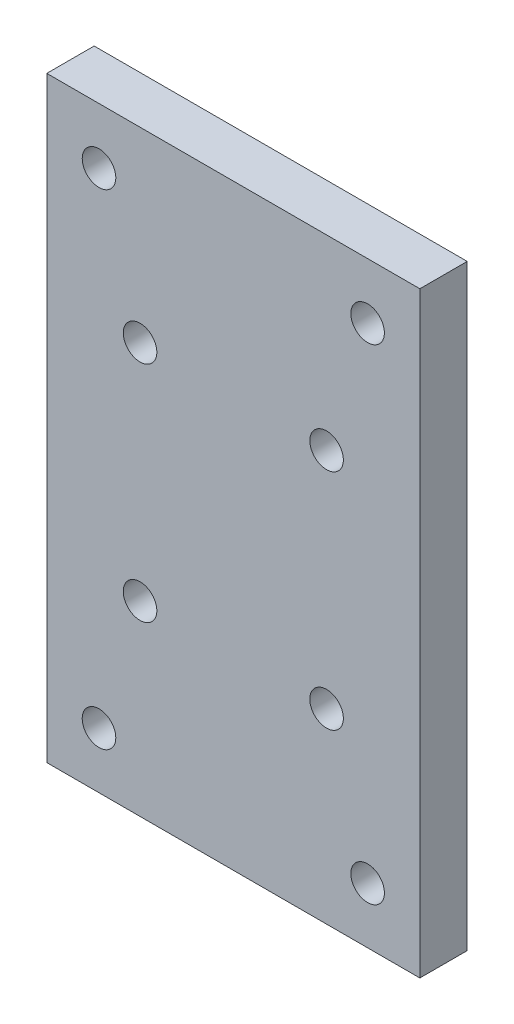
ISO-10303-21;
HEADER;
FILE_DESCRIPTION(('STEP AP214'),'2;1');
FILE_NAME('part.step','',(''),(''),'','','');
FILE_SCHEMA(('AUTOMOTIVE_DESIGN { 1 0 10303 214 1 1 1 1 }'));
ENDSEC;
DATA;
#1=APPLICATION_CONTEXT('core data for automotive mechanical design processes');
#2=APPLICATION_PROTOCOL_DEFINITION('international standard','automotive_design',2000,#1);
#3=PRODUCT_CONTEXT('',#1,'mechanical');
#4=PRODUCT('Part','Part','',(#3));
#5=PRODUCT_RELATED_PRODUCT_CATEGORY('part','',(#4));
#6=PRODUCT_DEFINITION_FORMATION('','',#4);
#7=PRODUCT_DEFINITION_CONTEXT('part definition',#1,'design');
#8=PRODUCT_DEFINITION('design','',#6,#7);
#9=PRODUCT_DEFINITION_SHAPE('','',#8);
#10=(LENGTH_UNIT() NAMED_UNIT(*) SI_UNIT(.MILLI.,.METRE.));
#11=(NAMED_UNIT(*) PLANE_ANGLE_UNIT() SI_UNIT($,.RADIAN.));
#12=(NAMED_UNIT(*) SI_UNIT($,.STERADIAN.) SOLID_ANGLE_UNIT());
#13=UNCERTAINTY_MEASURE_WITH_UNIT(LENGTH_MEASURE(1.E-05),#10,'distance_accuracy_value','');
#14=(GEOMETRIC_REPRESENTATION_CONTEXT(3) GLOBAL_UNCERTAINTY_ASSIGNED_CONTEXT((#13)) GLOBAL_UNIT_ASSIGNED_CONTEXT((#10,
#11,#12)) REPRESENTATION_CONTEXT('',''));
#15=CARTESIAN_POINT('',(0.,0.,0.));
#16=DIRECTION('',(0.,0.,1.));
#17=DIRECTION('',(1.,0.,0.));
#18=AXIS2_PLACEMENT_3D('',#15,#16,#17);
#19=CARTESIAN_POINT('',(0.,0.,12.7));
#20=DIRECTION('',(0.,0.,-1.));
#21=DIRECTION('',(-1.,0.,0.));
#22=AXIS2_PLACEMENT_3D('',#19,#20,#21);
#23=PLANE('',#22);
#24=CARTESIAN_POINT('',(14.,15.,12.7));
#25=DIRECTION('',(0.,0.,1.));
#26=DIRECTION('',(1.,0.,0.));
#27=AXIS2_PLACEMENT_3D('',#24,#25,#26);
#28=CIRCLE('',#27,4.5);
#29=CARTESIAN_POINT('',(18.5,15.,12.7));
#30=VERTEX_POINT('',#29);
#31=EDGE_CURVE('E144',#30,#30,#28,.T.);
#32=ORIENTED_EDGE('',*,*,#31,.F.);
#33=EDGE_LOOP('',(#32));
#34=FACE_BOUND('',#33,.T.);
#35=CARTESIAN_POINT('',(86.,15.,12.7));
#36=DIRECTION('',(0.,0.,1.));
#37=DIRECTION('',(1.,0.,0.));
#38=AXIS2_PLACEMENT_3D('',#35,#36,#37);
#39=CIRCLE('',#38,4.5);
#40=CARTESIAN_POINT('',(90.5,15.,12.7));
#41=VERTEX_POINT('',#40);
#42=EDGE_CURVE('E141',#41,#41,#39,.T.);
#43=ORIENTED_EDGE('',*,*,#42,.F.);
#44=EDGE_LOOP('',(#43));
#45=FACE_BOUND('',#44,.T.);
#46=CARTESIAN_POINT('',(25.,110.,12.7));
#47=DIRECTION('',(0.,0.,1.));
#48=DIRECTION('',(1.,0.,0.));
#49=AXIS2_PLACEMENT_3D('',#46,#47,#48);
#50=CIRCLE('',#49,4.50000000000002);
#51=CARTESIAN_POINT('',(29.5,110.,12.7));
#52=VERTEX_POINT('',#51);
#53=EDGE_CURVE('E120',#52,#52,#50,.T.);
#54=ORIENTED_EDGE('',*,*,#53,.F.);
#55=EDGE_LOOP('',(#54));
#56=FACE_BOUND('',#55,.T.);
#57=CARTESIAN_POINT('',(75.,110.,12.7));
#58=DIRECTION('',(0.,0.,1.));
#59=DIRECTION('',(1.,0.,0.));
#60=AXIS2_PLACEMENT_3D('',#57,#58,#59);
#61=CIRCLE('',#60,4.50000000000002);
#62=CARTESIAN_POINT('',(79.5,110.,12.7));
#63=VERTEX_POINT('',#62);
#64=EDGE_CURVE('E117',#63,#63,#61,.T.);
#65=ORIENTED_EDGE('',*,*,#64,.F.);
#66=EDGE_LOOP('',(#65));
#67=FACE_BOUND('',#66,.T.);
#68=DIRECTION('',(0.,-1.,0.));
#69=VECTOR('',#68,1.);
#70=CARTESIAN_POINT('',(0.,0.,12.7));
#71=LINE('',#70,#69);
#72=CARTESIAN_POINT('',(0.,160.,12.7));
#73=VERTEX_POINT('',#72);
#74=CARTESIAN_POINT('',(0.,0.,12.7));
#75=VERTEX_POINT('',#74);
#76=EDGE_CURVE('E88',#73,#75,#71,.T.);
#77=ORIENTED_EDGE('',*,*,#76,.T.);
#78=DIRECTION('',(1.,0.,0.));
#79=VECTOR('',#78,1.);
#80=CARTESIAN_POINT('',(0.,0.,12.7));
#81=LINE('',#80,#79);
#82=CARTESIAN_POINT('',(100.,0.,12.7));
#83=VERTEX_POINT('',#82);
#84=EDGE_CURVE('E83',#75,#83,#81,.T.);
#85=ORIENTED_EDGE('',*,*,#84,.T.);
#86=DIRECTION('',(0.,1.,0.));
#87=VECTOR('',#86,1.);
#88=CARTESIAN_POINT('',(100.,0.,12.7));
#89=LINE('',#88,#87);
#90=CARTESIAN_POINT('',(100.,160.,12.7));
#91=VERTEX_POINT('',#90);
#92=EDGE_CURVE('E86',#83,#91,#89,.T.);
#93=ORIENTED_EDGE('',*,*,#92,.T.);
#94=DIRECTION('',(-1.,0.,0.));
#95=VECTOR('',#94,1.);
#96=CARTESIAN_POINT('',(0.,160.,12.7));
#97=LINE('',#96,#95);
#98=EDGE_CURVE('E53',#91,#73,#97,.T.);
#99=ORIENTED_EDGE('',*,*,#98,.T.);
#100=EDGE_LOOP('',(#77,#85,#93,#99));
#101=FACE_BOUND('',#100,.T.);
#102=CARTESIAN_POINT('',(25.,50.,12.7));
#103=DIRECTION('',(0.,0.,-1.));
#104=DIRECTION('',(-1.,0.,0.));
#105=AXIS2_PLACEMENT_3D('',#102,#103,#104);
#106=CIRCLE('',#105,4.50000000000002);
#107=CARTESIAN_POINT('',(20.5,50.,12.7));
#108=VERTEX_POINT('',#107);
#109=EDGE_CURVE('E129',#108,#108,#106,.T.);
#110=ORIENTED_EDGE('',*,*,#109,.T.);
#111=EDGE_LOOP('',(#110));
#112=FACE_BOUND('',#111,.T.);
#113=CARTESIAN_POINT('',(75.,50.,12.7));
#114=DIRECTION('',(0.,0.,-1.));
#115=DIRECTION('',(-1.,0.,0.));
#116=AXIS2_PLACEMENT_3D('',#113,#114,#115);
#117=CIRCLE('',#116,4.50000000000002);
#118=CARTESIAN_POINT('',(70.5,50.,12.7));
#119=VERTEX_POINT('',#118);
#120=EDGE_CURVE('E121',#119,#119,#117,.T.);
#121=ORIENTED_EDGE('',*,*,#120,.T.);
#122=EDGE_LOOP('',(#121));
#123=FACE_BOUND('',#122,.T.);
#124=CARTESIAN_POINT('',(14.,145.,12.7));
#125=DIRECTION('',(0.,0.,-1.));
#126=DIRECTION('',(-1.,0.,0.));
#127=AXIS2_PLACEMENT_3D('',#124,#125,#126);
#128=CIRCLE('',#127,4.50000000000001);
#129=CARTESIAN_POINT('',(9.49999999999997,145.,12.7));
#130=VERTEX_POINT('',#129);
#131=EDGE_CURVE('E152',#130,#130,#128,.T.);
#132=ORIENTED_EDGE('',*,*,#131,.T.);
#133=EDGE_LOOP('',(#132));
#134=FACE_BOUND('',#133,.T.);
#135=CARTESIAN_POINT('',(86.,145.,12.7));
#136=DIRECTION('',(0.,0.,-1.));
#137=DIRECTION('',(-1.,0.,0.));
#138=AXIS2_PLACEMENT_3D('',#135,#136,#137);
#139=CIRCLE('',#138,4.50000000000002);
#140=CARTESIAN_POINT('',(81.5,145.,12.7));
#141=VERTEX_POINT('',#140);
#142=EDGE_CURVE('E145',#141,#141,#139,.T.);
#143=ORIENTED_EDGE('',*,*,#142,.T.);
#144=EDGE_LOOP('',(#143));
#145=FACE_BOUND('',#144,.T.);
#146=ADVANCED_FACE('F36',(#34,#45,#56,#67,#101,#112,#123,#134,#145),#23,.F.);
#147=CARTESIAN_POINT('',(0.,0.,0.));
#148=DIRECTION('',(0.,0.,-1.));
#149=DIRECTION('',(-1.,0.,0.));
#150=AXIS2_PLACEMENT_3D('',#147,#148,#149);
#151=PLANE('',#150);
#152=CARTESIAN_POINT('',(14.,15.,0.));
#153=DIRECTION('',(0.,0.,-1.));
#154=DIRECTION('',(-1.,0.,0.));
#155=AXIS2_PLACEMENT_3D('',#152,#153,#154);
#156=CIRCLE('',#155,4.5);
#157=CARTESIAN_POINT('',(9.5,15.,0.));
#158=VERTEX_POINT('',#157);
#159=EDGE_CURVE('E148',#158,#158,#156,.F.);
#160=ORIENTED_EDGE('',*,*,#159,.T.);
#161=EDGE_LOOP('',(#160));
#162=FACE_BOUND('',#161,.T.);
#163=CARTESIAN_POINT('',(14.,145.,0.));
#164=DIRECTION('',(0.,0.,-1.));
#165=DIRECTION('',(-1.,0.,0.));
#166=AXIS2_PLACEMENT_3D('',#163,#164,#165);
#167=CIRCLE('',#166,4.50000000000001);
#168=CARTESIAN_POINT('',(9.49999999999997,145.,0.));
#169=VERTEX_POINT('',#168);
#170=EDGE_CURVE('E159',#169,#169,#167,.T.);
#171=ORIENTED_EDGE('',*,*,#170,.F.);
#172=EDGE_LOOP('',(#171));
#173=FACE_BOUND('',#172,.T.);
#174=CARTESIAN_POINT('',(86.,15.,0.));
#175=DIRECTION('',(0.,0.,-1.));
#176=DIRECTION('',(-1.,0.,0.));
#177=AXIS2_PLACEMENT_3D('',#174,#175,#176);
#178=CIRCLE('',#177,4.5);
#179=CARTESIAN_POINT('',(81.5,15.,0.));
#180=VERTEX_POINT('',#179);
#181=EDGE_CURVE('E128',#180,#180,#178,.F.);
#182=ORIENTED_EDGE('',*,*,#181,.T.);
#183=EDGE_LOOP('',(#182));
#184=FACE_BOUND('',#183,.T.);
#185=CARTESIAN_POINT('',(25.,50.,0.));
#186=DIRECTION('',(0.,0.,-1.));
#187=DIRECTION('',(-1.,0.,0.));
#188=AXIS2_PLACEMENT_3D('',#185,#186,#187);
#189=CIRCLE('',#188,4.50000000000002);
#190=CARTESIAN_POINT('',(20.5,50.,0.));
#191=VERTEX_POINT('',#190);
#192=EDGE_CURVE('E124',#191,#191,#189,.T.);
#193=ORIENTED_EDGE('',*,*,#192,.F.);
#194=EDGE_LOOP('',(#193));
#195=FACE_BOUND('',#194,.T.);
#196=CARTESIAN_POINT('',(25.,110.,0.));
#197=DIRECTION('',(0.,0.,-1.));
#198=DIRECTION('',(-1.,0.,0.));
#199=AXIS2_PLACEMENT_3D('',#196,#197,#198);
#200=CIRCLE('',#199,4.50000000000002);
#201=CARTESIAN_POINT('',(20.5,110.,0.));
#202=VERTEX_POINT('',#201);
#203=EDGE_CURVE('E132',#202,#202,#200,.F.);
#204=ORIENTED_EDGE('',*,*,#203,.T.);
#205=EDGE_LOOP('',(#204));
#206=FACE_BOUND('',#205,.T.);
#207=CARTESIAN_POINT('',(75.,110.,0.));
#208=DIRECTION('',(0.,0.,-1.));
#209=DIRECTION('',(-1.,0.,0.));
#210=AXIS2_PLACEMENT_3D('',#207,#208,#209);
#211=CIRCLE('',#210,4.50000000000002);
#212=CARTESIAN_POINT('',(70.5,110.,0.));
#213=VERTEX_POINT('',#212);
#214=EDGE_CURVE('E103',#213,#213,#211,.F.);
#215=ORIENTED_EDGE('',*,*,#214,.T.);
#216=EDGE_LOOP('',(#215));
#217=FACE_BOUND('',#216,.T.);
#218=DIRECTION('',(0.,-1.,0.));
#219=VECTOR('',#218,1.);
#220=CARTESIAN_POINT('',(0.,0.,0.));
#221=LINE('',#220,#219);
#222=CARTESIAN_POINT('',(0.,160.,0.));
#223=VERTEX_POINT('',#222);
#224=CARTESIAN_POINT('',(0.,0.,0.));
#225=VERTEX_POINT('',#224);
#226=EDGE_CURVE('E100',#223,#225,#221,.T.);
#227=ORIENTED_EDGE('',*,*,#226,.F.);
#228=DIRECTION('',(-1.,0.,0.));
#229=VECTOR('',#228,1.);
#230=CARTESIAN_POINT('',(0.,160.,0.));
#231=LINE('',#230,#229);
#232=CARTESIAN_POINT('',(100.,160.,0.));
#233=VERTEX_POINT('',#232);
#234=EDGE_CURVE('E76',#233,#223,#231,.T.);
#235=ORIENTED_EDGE('',*,*,#234,.F.);
#236=DIRECTION('',(0.,1.,0.));
#237=VECTOR('',#236,1.);
#238=CARTESIAN_POINT('',(100.,0.,0.));
#239=LINE('',#238,#237);
#240=CARTESIAN_POINT('',(100.,0.,0.));
#241=VERTEX_POINT('',#240);
#242=EDGE_CURVE('E70',#241,#233,#239,.T.);
#243=ORIENTED_EDGE('',*,*,#242,.F.);
#244=DIRECTION('',(1.,0.,0.));
#245=VECTOR('',#244,1.);
#246=CARTESIAN_POINT('',(0.,0.,0.));
#247=LINE('',#246,#245);
#248=EDGE_CURVE('E92',#225,#241,#247,.T.);
#249=ORIENTED_EDGE('',*,*,#248,.F.);
#250=EDGE_LOOP('',(#227,#235,#243,#249));
#251=FACE_BOUND('',#250,.T.);
#252=CARTESIAN_POINT('',(75.,50.,0.));
#253=DIRECTION('',(0.,0.,-1.));
#254=DIRECTION('',(-1.,0.,0.));
#255=AXIS2_PLACEMENT_3D('',#252,#253,#254);
#256=CIRCLE('',#255,4.50000000000002);
#257=CARTESIAN_POINT('',(70.5,50.,0.));
#258=VERTEX_POINT('',#257);
#259=EDGE_CURVE('E125',#258,#258,#256,.T.);
#260=ORIENTED_EDGE('',*,*,#259,.F.);
#261=EDGE_LOOP('',(#260));
#262=FACE_BOUND('',#261,.T.);
#263=CARTESIAN_POINT('',(86.,145.,0.));
#264=DIRECTION('',(0.,0.,-1.));
#265=DIRECTION('',(-1.,0.,0.));
#266=AXIS2_PLACEMENT_3D('',#263,#264,#265);
#267=CIRCLE('',#266,4.50000000000002);
#268=CARTESIAN_POINT('',(81.5,145.,0.));
#269=VERTEX_POINT('',#268);
#270=EDGE_CURVE('E149',#269,#269,#267,.T.);
#271=ORIENTED_EDGE('',*,*,#270,.F.);
#272=EDGE_LOOP('',(#271));
#273=FACE_BOUND('',#272,.T.);
#274=ADVANCED_FACE('F111',(#162,#173,#184,#195,#206,#217,#251,#262,#273),#151,.T.);
#275=CARTESIAN_POINT('',(0.,0.,12.7));
#276=DIRECTION('',(1.,0.,0.));
#277=DIRECTION('',(0.,0.,-1.));
#278=AXIS2_PLACEMENT_3D('',#275,#276,#277);
#279=PLANE('',#278);
#280=ORIENTED_EDGE('',*,*,#226,.T.);
#281=DIRECTION('',(0.,0.,-1.));
#282=VECTOR('',#281,1.);
#283=CARTESIAN_POINT('',(0.,0.,12.7));
#284=LINE('',#283,#282);
#285=EDGE_CURVE('E11',#75,#225,#284,.T.);
#286=ORIENTED_EDGE('',*,*,#285,.F.);
#287=ORIENTED_EDGE('',*,*,#76,.F.);
#288=DIRECTION('',(0.,0.,-1.));
#289=VECTOR('',#288,1.);
#290=CARTESIAN_POINT('',(0.,160.,12.7));
#291=LINE('',#290,#289);
#292=EDGE_CURVE('E96',#73,#223,#291,.T.);
#293=ORIENTED_EDGE('',*,*,#292,.T.);
#294=EDGE_LOOP('',(#280,#286,#287,#293));
#295=FACE_BOUND('',#294,.T.);
#296=ADVANCED_FACE('F38',(#295),#279,.F.);
#297=CARTESIAN_POINT('',(0.,0.,12.7));
#298=DIRECTION('',(0.,1.,0.));
#299=DIRECTION('',(0.,0.,1.));
#300=AXIS2_PLACEMENT_3D('',#297,#298,#299);
#301=PLANE('',#300);
#302=ORIENTED_EDGE('',*,*,#248,.T.);
#303=DIRECTION('',(0.,0.,-1.));
#304=VECTOR('',#303,1.);
#305=CARTESIAN_POINT('',(100.,0.,12.7));
#306=LINE('',#305,#304);
#307=EDGE_CURVE('E45',#83,#241,#306,.T.);
#308=ORIENTED_EDGE('',*,*,#307,.F.);
#309=ORIENTED_EDGE('',*,*,#84,.F.);
#310=ORIENTED_EDGE('',*,*,#285,.T.);
#311=EDGE_LOOP('',(#302,#308,#309,#310));
#312=FACE_BOUND('',#311,.T.);
#313=ADVANCED_FACE('F91',(#312),#301,.F.);
#314=CARTESIAN_POINT('',(100.,0.,12.7));
#315=DIRECTION('',(-1.,0.,0.));
#316=DIRECTION('',(0.,0.,1.));
#317=AXIS2_PLACEMENT_3D('',#314,#315,#316);
#318=PLANE('',#317);
#319=ORIENTED_EDGE('',*,*,#242,.T.);
#320=DIRECTION('',(0.,0.,-1.));
#321=VECTOR('',#320,1.);
#322=CARTESIAN_POINT('',(100.,160.,12.7));
#323=LINE('',#322,#321);
#324=EDGE_CURVE('E93',#91,#233,#323,.T.);
#325=ORIENTED_EDGE('',*,*,#324,.F.);
#326=ORIENTED_EDGE('',*,*,#92,.F.);
#327=ORIENTED_EDGE('',*,*,#307,.T.);
#328=EDGE_LOOP('',(#319,#325,#326,#327));
#329=FACE_BOUND('',#328,.T.);
#330=ADVANCED_FACE('F94',(#329),#318,.F.);
#331=CARTESIAN_POINT('',(0.,160.,12.7));
#332=DIRECTION('',(0.,-1.,0.));
#333=DIRECTION('',(0.,0.,-1.));
#334=AXIS2_PLACEMENT_3D('',#331,#332,#333);
#335=PLANE('',#334);
#336=ORIENTED_EDGE('',*,*,#234,.T.);
#337=ORIENTED_EDGE('',*,*,#292,.F.);
#338=ORIENTED_EDGE('',*,*,#98,.F.);
#339=ORIENTED_EDGE('',*,*,#324,.T.);
#340=EDGE_LOOP('',(#336,#337,#338,#339));
#341=FACE_BOUND('',#340,.T.);
#342=ADVANCED_FACE('F108',(#341),#335,.F.);
#343=CARTESIAN_POINT('',(75.,110.,-12.7279220613579));
#344=DIRECTION('',(0.,0.,1.));
#345=DIRECTION('',(1.,0.,0.));
#346=AXIS2_PLACEMENT_3D('',#343,#344,#345);
#347=CYLINDRICAL_SURFACE('',#346,4.50000000000002);
#348=ORIENTED_EDGE('',*,*,#64,.T.);
#349=EDGE_LOOP('',(#348));
#350=FACE_BOUND('',#349,.T.);
#351=ORIENTED_EDGE('',*,*,#214,.F.);
#352=EDGE_LOOP('',(#351));
#353=FACE_BOUND('',#352,.T.);
#354=ADVANCED_FACE('F177',(#350,#353),#347,.F.);
#355=CARTESIAN_POINT('',(25.,110.,-12.7279220613579));
#356=DIRECTION('',(0.,0.,1.));
#357=DIRECTION('',(1.,0.,0.));
#358=AXIS2_PLACEMENT_3D('',#355,#356,#357);
#359=CYLINDRICAL_SURFACE('',#358,4.50000000000002);
#360=ORIENTED_EDGE('',*,*,#53,.T.);
#361=EDGE_LOOP('',(#360));
#362=FACE_BOUND('',#361,.T.);
#363=ORIENTED_EDGE('',*,*,#203,.F.);
#364=EDGE_LOOP('',(#363));
#365=FACE_BOUND('',#364,.T.);
#366=ADVANCED_FACE('F179',(#362,#365),#359,.F.);
#367=CARTESIAN_POINT('',(25.,50.,-12.7279220613579));
#368=DIRECTION('',(0.,0.,1.));
#369=DIRECTION('',(1.,0.,0.));
#370=AXIS2_PLACEMENT_3D('',#367,#368,#369);
#371=CYLINDRICAL_SURFACE('',#370,4.50000000000002);
#372=ORIENTED_EDGE('',*,*,#109,.F.);
#373=EDGE_LOOP('',(#372));
#374=FACE_BOUND('',#373,.T.);
#375=ORIENTED_EDGE('',*,*,#192,.T.);
#376=EDGE_LOOP('',(#375));
#377=FACE_BOUND('',#376,.T.);
#378=ADVANCED_FACE('F186',(#374,#377),#371,.F.);
#379=CARTESIAN_POINT('',(75.,50.,-12.7279220613579));
#380=DIRECTION('',(0.,0.,1.));
#381=DIRECTION('',(1.,0.,0.));
#382=AXIS2_PLACEMENT_3D('',#379,#380,#381);
#383=CYLINDRICAL_SURFACE('',#382,4.50000000000002);
#384=ORIENTED_EDGE('',*,*,#120,.F.);
#385=EDGE_LOOP('',(#384));
#386=FACE_BOUND('',#385,.T.);
#387=ORIENTED_EDGE('',*,*,#259,.T.);
#388=EDGE_LOOP('',(#387));
#389=FACE_BOUND('',#388,.T.);
#390=ADVANCED_FACE('F224',(#386,#389),#383,.F.);
#391=CARTESIAN_POINT('',(86.,15.,-12.7279220613579));
#392=DIRECTION('',(0.,0.,1.));
#393=DIRECTION('',(1.,0.,0.));
#394=AXIS2_PLACEMENT_3D('',#391,#392,#393);
#395=CYLINDRICAL_SURFACE('',#394,4.5);
#396=ORIENTED_EDGE('',*,*,#42,.T.);
#397=EDGE_LOOP('',(#396));
#398=FACE_BOUND('',#397,.T.);
#399=ORIENTED_EDGE('',*,*,#181,.F.);
#400=EDGE_LOOP('',(#399));
#401=FACE_BOUND('',#400,.T.);
#402=ADVANCED_FACE('F219',(#398,#401),#395,.F.);
#403=CARTESIAN_POINT('',(14.,145.,-12.7279220613579));
#404=DIRECTION('',(0.,0.,1.));
#405=DIRECTION('',(1.,0.,0.));
#406=AXIS2_PLACEMENT_3D('',#403,#404,#405);
#407=CYLINDRICAL_SURFACE('',#406,4.50000000000001);
#408=ORIENTED_EDGE('',*,*,#131,.F.);
#409=EDGE_LOOP('',(#408));
#410=FACE_BOUND('',#409,.T.);
#411=ORIENTED_EDGE('',*,*,#170,.T.);
#412=EDGE_LOOP('',(#411));
#413=FACE_BOUND('',#412,.T.);
#414=ADVANCED_FACE('F163',(#410,#413),#407,.F.);
#415=CARTESIAN_POINT('',(86.,145.,-12.7279220613579));
#416=DIRECTION('',(0.,0.,1.));
#417=DIRECTION('',(1.,0.,0.));
#418=AXIS2_PLACEMENT_3D('',#415,#416,#417);
#419=CYLINDRICAL_SURFACE('',#418,4.50000000000002);
#420=ORIENTED_EDGE('',*,*,#142,.F.);
#421=EDGE_LOOP('',(#420));
#422=FACE_BOUND('',#421,.T.);
#423=ORIENTED_EDGE('',*,*,#270,.T.);
#424=EDGE_LOOP('',(#423));
#425=FACE_BOUND('',#424,.T.);
#426=ADVANCED_FACE('F235',(#422,#425),#419,.F.);
#427=CARTESIAN_POINT('',(14.,15.,-12.7279220613579));
#428=DIRECTION('',(0.,0.,1.));
#429=DIRECTION('',(1.,0.,0.));
#430=AXIS2_PLACEMENT_3D('',#427,#428,#429);
#431=CYLINDRICAL_SURFACE('',#430,4.5);
#432=ORIENTED_EDGE('',*,*,#31,.T.);
#433=EDGE_LOOP('',(#432));
#434=FACE_BOUND('',#433,.T.);
#435=ORIENTED_EDGE('',*,*,#159,.F.);
#436=EDGE_LOOP('',(#435));
#437=FACE_BOUND('',#436,.T.);
#438=ADVANCED_FACE('F245',(#434,#437),#431,.F.);
#439=CLOSED_SHELL('',(#146,#274,#296,#313,#330,#342,#354,#366,#378,#390,#402,#414,#426,#438));
#440=MANIFOLD_SOLID_BREP('B2',#439);
#441=ADVANCED_BREP_SHAPE_REPRESENTATION('',(#18,#440),#14);
#442=SHAPE_DEFINITION_REPRESENTATION(#9,#441);
ENDSEC;
END-ISO-10303-21;
